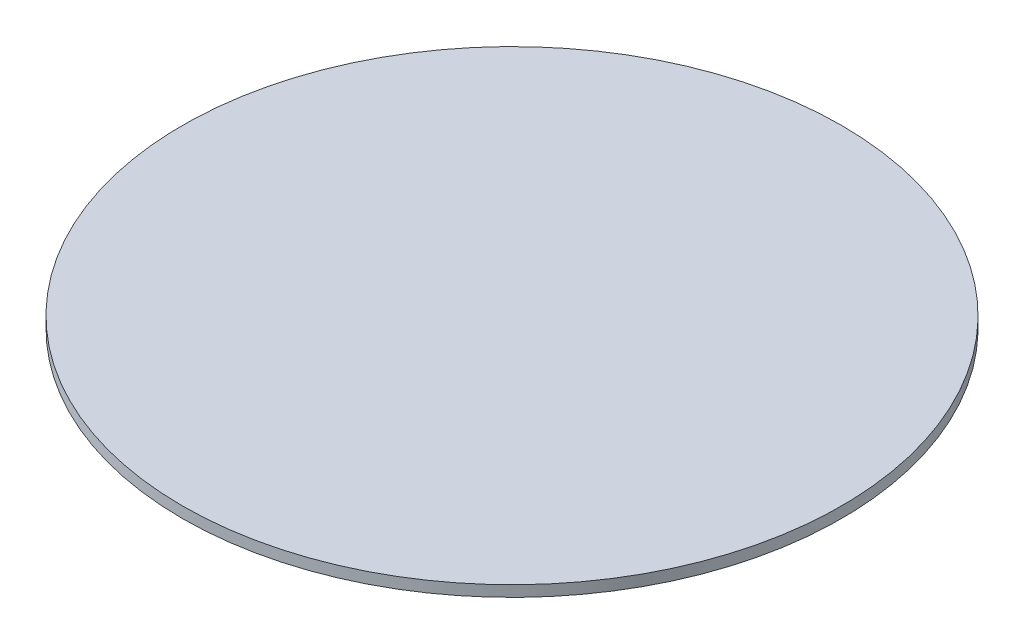
ISO-10303-21;
HEADER;
FILE_DESCRIPTION(('STEP AP214'),'2;1');
FILE_NAME('part.step','',(''),(''),'','','');
FILE_SCHEMA(('AUTOMOTIVE_DESIGN { 1 0 10303 214 1 1 1 1 }'));
ENDSEC;
DATA;
#1=APPLICATION_CONTEXT('core data for automotive mechanical design processes');
#2=APPLICATION_PROTOCOL_DEFINITION('international standard','automotive_design',2000,#1);
#3=PRODUCT_CONTEXT('',#1,'mechanical');
#4=PRODUCT('Part','Part','',(#3));
#5=PRODUCT_RELATED_PRODUCT_CATEGORY('part','',(#4));
#6=PRODUCT_DEFINITION_FORMATION('','',#4);
#7=PRODUCT_DEFINITION_CONTEXT('part definition',#1,'design');
#8=PRODUCT_DEFINITION('design','',#6,#7);
#9=PRODUCT_DEFINITION_SHAPE('','',#8);
#10=(LENGTH_UNIT() NAMED_UNIT(*) SI_UNIT(.MILLI.,.METRE.));
#11=(NAMED_UNIT(*) PLANE_ANGLE_UNIT() SI_UNIT($,.RADIAN.));
#12=(NAMED_UNIT(*) SI_UNIT($,.STERADIAN.) SOLID_ANGLE_UNIT());
#13=UNCERTAINTY_MEASURE_WITH_UNIT(LENGTH_MEASURE(1.E-05),#10,'distance_accuracy_value','');
#14=(GEOMETRIC_REPRESENTATION_CONTEXT(3) GLOBAL_UNCERTAINTY_ASSIGNED_CONTEXT((#13)) GLOBAL_UNIT_ASSIGNED_CONTEXT((#10,
#11,#12)) REPRESENTATION_CONTEXT('',''));
#15=CARTESIAN_POINT('',(0.,0.,0.));
#16=DIRECTION('',(0.,0.,1.));
#17=DIRECTION('',(1.,0.,0.));
#18=AXIS2_PLACEMENT_3D('',#15,#16,#17);
#19=CARTESIAN_POINT('',(0.,5.08,0.));
#20=DIRECTION('',(0.,-1.,0.));
#21=DIRECTION('',(0.,0.,-1.));
#22=AXIS2_PLACEMENT_3D('',#19,#20,#21);
#23=CYLINDRICAL_SURFACE('',#22,152.4);
#24=CARTESIAN_POINT('',(0.,5.08,0.));
#25=DIRECTION('',(0.,1.,0.));
#26=DIRECTION('',(0.,0.,1.));
#27=AXIS2_PLACEMENT_3D('',#24,#25,#26);
#28=CIRCLE('',#27,152.4);
#29=CARTESIAN_POINT('',(0.,5.08,152.4));
#30=VERTEX_POINT('',#29);
#31=EDGE_CURVE('E10',#30,#30,#28,.T.);
#32=ORIENTED_EDGE('',*,*,#31,.F.);
#33=EDGE_LOOP('',(#32));
#34=FACE_BOUND('',#33,.T.);
#35=CARTESIAN_POINT('',(0.,0.,0.));
#36=DIRECTION('',(0.,1.,0.));
#37=DIRECTION('',(0.,0.,1.));
#38=AXIS2_PLACEMENT_3D('',#35,#36,#37);
#39=CIRCLE('',#38,152.4);
#40=CARTESIAN_POINT('',(0.,0.,152.4));
#41=VERTEX_POINT('',#40);
#42=EDGE_CURVE('E42',#41,#41,#39,.T.);
#43=ORIENTED_EDGE('',*,*,#42,.T.);
#44=EDGE_LOOP('',(#43));
#45=FACE_BOUND('',#44,.T.);
#46=ADVANCED_FACE('F39',(#34,#45),#23,.T.);
#47=CARTESIAN_POINT('',(0.,5.08,0.));
#48=DIRECTION('',(0.,1.,0.));
#49=DIRECTION('',(0.,0.,1.));
#50=AXIS2_PLACEMENT_3D('',#47,#48,#49);
#51=PLANE('',#50);
#52=ORIENTED_EDGE('',*,*,#31,.T.);
#53=EDGE_LOOP('',(#52));
#54=FACE_BOUND('',#53,.T.);
#55=ADVANCED_FACE('F56',(#54),#51,.T.);
#56=CARTESIAN_POINT('',(0.,0.,0.));
#57=DIRECTION('',(0.,1.,0.));
#58=DIRECTION('',(0.,0.,1.));
#59=AXIS2_PLACEMENT_3D('',#56,#57,#58);
#60=PLANE('',#59);
#61=ORIENTED_EDGE('',*,*,#42,.F.);
#62=EDGE_LOOP('',(#61));
#63=FACE_BOUND('',#62,.T.);
#64=ADVANCED_FACE('F54',(#63),#60,.F.);
#65=CLOSED_SHELL('',(#46,#55,#64));
#66=MANIFOLD_SOLID_BREP('B2',#65);
#67=ADVANCED_BREP_SHAPE_REPRESENTATION('',(#18,#66),#14);
#68=SHAPE_DEFINITION_REPRESENTATION(#9,#67);
ENDSEC;
END-ISO-10303-21;
